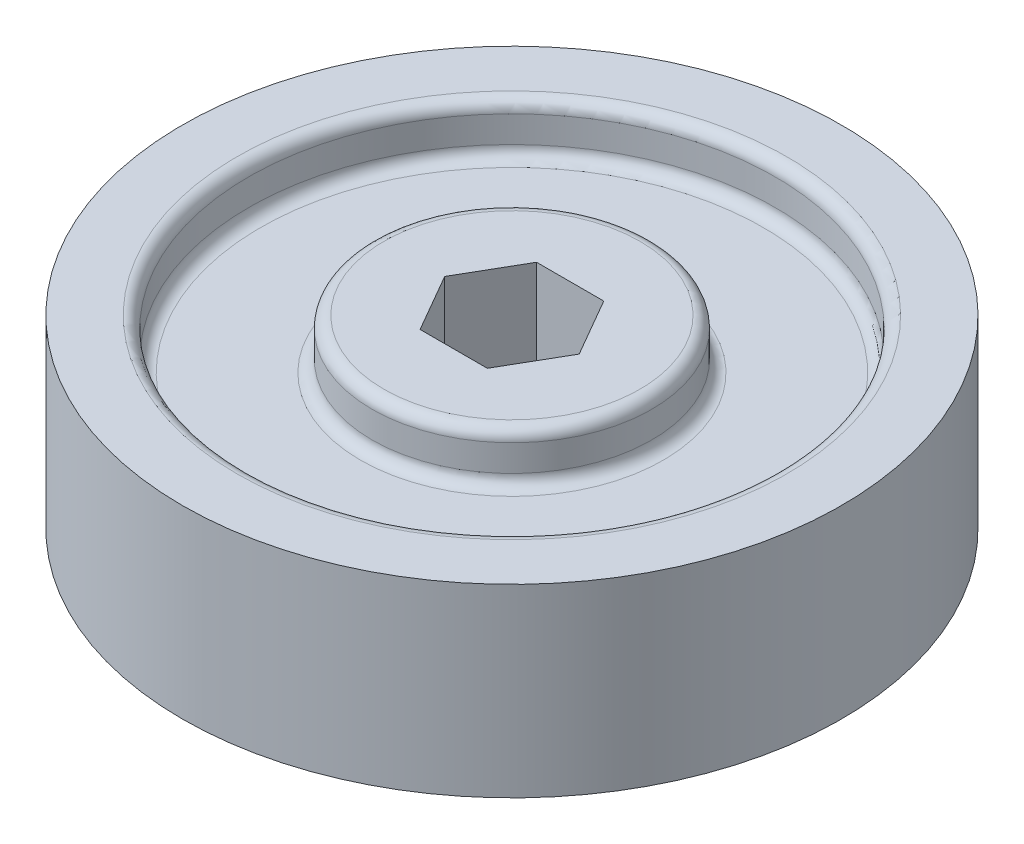
ISO-10303-21;
HEADER;
FILE_DESCRIPTION(('STEP AP214'),'2;1');
FILE_NAME('part.step','',(''),(''),'','','');
FILE_SCHEMA(('AUTOMOTIVE_DESIGN { 1 0 10303 214 1 1 1 1 }'));
ENDSEC;
DATA;
#1=APPLICATION_CONTEXT('core data for automotive mechanical design processes');
#2=APPLICATION_PROTOCOL_DEFINITION('international standard','automotive_design',2000,#1);
#3=PRODUCT_CONTEXT('',#1,'mechanical');
#4=PRODUCT('Part','Part','',(#3));
#5=PRODUCT_RELATED_PRODUCT_CATEGORY('part','',(#4));
#6=PRODUCT_DEFINITION_FORMATION('','',#4);
#7=PRODUCT_DEFINITION_CONTEXT('part definition',#1,'design');
#8=PRODUCT_DEFINITION('design','',#6,#7);
#9=PRODUCT_DEFINITION_SHAPE('','',#8);
#10=(LENGTH_UNIT() NAMED_UNIT(*) SI_UNIT(.MILLI.,.METRE.));
#11=(NAMED_UNIT(*) PLANE_ANGLE_UNIT() SI_UNIT($,.RADIAN.));
#12=(NAMED_UNIT(*) SI_UNIT($,.STERADIAN.) SOLID_ANGLE_UNIT());
#13=UNCERTAINTY_MEASURE_WITH_UNIT(LENGTH_MEASURE(1.E-05),#10,'distance_accuracy_value','');
#14=(GEOMETRIC_REPRESENTATION_CONTEXT(3) GLOBAL_UNCERTAINTY_ASSIGNED_CONTEXT((#13)) GLOBAL_UNIT_ASSIGNED_CONTEXT((#10,
#11,#12)) REPRESENTATION_CONTEXT('',''));
#15=CARTESIAN_POINT('',(0.,0.,0.));
#16=DIRECTION('',(0.,0.,1.));
#17=DIRECTION('',(1.,0.,0.));
#18=AXIS2_PLACEMENT_3D('',#15,#16,#17);
#19=CARTESIAN_POINT('',(0.,0.,0.));
#20=DIRECTION('',(0.,1.,0.));
#21=DIRECTION('',(0.,0.,1.));
#22=AXIS2_PLACEMENT_3D('',#19,#20,#21);
#23=PLANE('',#22);
#24=CARTESIAN_POINT('',(0.,0.,0.));
#25=DIRECTION('',(0.,1.,0.));
#26=DIRECTION('',(0.,0.,1.));
#27=AXIS2_PLACEMENT_3D('',#24,#25,#26);
#28=CIRCLE('',#27,13.97);
#29=CARTESIAN_POINT('',(0.,0.,13.97));
#30=VERTEX_POINT('',#29);
#31=EDGE_CURVE('E11',#30,#30,#28,.F.);
#32=ORIENTED_EDGE('',*,*,#31,.T.);
#33=EDGE_LOOP('',(#32));
#34=FACE_BOUND('',#33,.T.);
#35=DIRECTION('',(1.,0.,0.));
#36=VECTOR('',#35,1.);
#37=CARTESIAN_POINT('',(-3.66617420935413,0.,6.35));
#38=LINE('',#37,#36);
#39=CARTESIAN_POINT('',(-3.66617420935413,0.,6.35));
#40=VERTEX_POINT('',#39);
#41=CARTESIAN_POINT('',(3.66617420935412,0.,6.35));
#42=VERTEX_POINT('',#41);
#43=EDGE_CURVE('E75',#40,#42,#38,.T.);
#44=ORIENTED_EDGE('',*,*,#43,.T.);
#45=DIRECTION('',(0.5,0.,-0.866025403784439));
#46=VECTOR('',#45,1.);
#47=CARTESIAN_POINT('',(3.66617420935412,0.,6.35));
#48=LINE('',#47,#46);
#49=CARTESIAN_POINT('',(7.33234841870825,0.,0.));
#50=VERTEX_POINT('',#49);
#51=EDGE_CURVE('E127',#42,#50,#48,.T.);
#52=ORIENTED_EDGE('',*,*,#51,.T.);
#53=DIRECTION('',(-0.5,0.,-0.866025403784439));
#54=VECTOR('',#53,1.);
#55=CARTESIAN_POINT('',(7.33234841870825,0.,0.));
#56=LINE('',#55,#54);
#57=CARTESIAN_POINT('',(3.66617420935413,0.,-6.35));
#58=VERTEX_POINT('',#57);
#59=EDGE_CURVE('E156',#50,#58,#56,.T.);
#60=ORIENTED_EDGE('',*,*,#59,.T.);
#61=DIRECTION('',(-1.,0.,0.));
#62=VECTOR('',#61,1.);
#63=CARTESIAN_POINT('',(3.66617420935413,0.,-6.35));
#64=LINE('',#63,#62);
#65=CARTESIAN_POINT('',(-3.66617420935412,0.,-6.35));
#66=VERTEX_POINT('',#65);
#67=EDGE_CURVE('E160',#58,#66,#64,.T.);
#68=ORIENTED_EDGE('',*,*,#67,.T.);
#69=DIRECTION('',(-0.5,0.,0.866025403784438));
#70=VECTOR('',#69,1.);
#71=CARTESIAN_POINT('',(-3.66617420935412,0.,-6.35));
#72=LINE('',#71,#70);
#73=CARTESIAN_POINT('',(-7.33234841870824,0.,0.));
#74=VERTEX_POINT('',#73);
#75=EDGE_CURVE('E164',#66,#74,#72,.T.);
#76=ORIENTED_EDGE('',*,*,#75,.T.);
#77=DIRECTION('',(0.5,0.,0.866025403784439));
#78=VECTOR('',#77,1.);
#79=CARTESIAN_POINT('',(-7.33234841870824,0.,0.));
#80=LINE('',#79,#78);
#81=EDGE_CURVE('E121',#74,#40,#80,.T.);
#82=ORIENTED_EDGE('',*,*,#81,.T.);
#83=EDGE_LOOP('',(#44,#52,#60,#68,#76,#82));
#84=FACE_BOUND('',#83,.T.);
#85=ADVANCED_FACE('F45',(#34,#84),#23,.F.);
#86=CARTESIAN_POINT('',(0.,20.1676,0.));
#87=DIRECTION('',(0.,1.,0.));
#88=DIRECTION('',(0.,0.,1.));
#89=AXIS2_PLACEMENT_3D('',#86,#87,#88);
#90=PLANE('',#89);
#91=CARTESIAN_POINT('',(0.,20.1676,0.));
#92=DIRECTION('',(0.,1.,0.));
#93=DIRECTION('',(0.,0.,1.));
#94=AXIS2_PLACEMENT_3D('',#91,#92,#93);
#95=CIRCLE('',#94,13.97);
#96=CARTESIAN_POINT('',(0.,20.1676,13.97));
#97=VERTEX_POINT('',#96);
#98=EDGE_CURVE('E206',#97,#97,#95,.T.);
#99=ORIENTED_EDGE('',*,*,#98,.T.);
#100=EDGE_LOOP('',(#99));
#101=FACE_BOUND('',#100,.T.);
#102=DIRECTION('',(0.5,0.,-0.866025403784439));
#103=VECTOR('',#102,1.);
#104=CARTESIAN_POINT('',(3.66617420935412,20.1676,6.35));
#105=LINE('',#104,#103);
#106=CARTESIAN_POINT('',(3.66617420935412,20.1676,6.35));
#107=VERTEX_POINT('',#106);
#108=CARTESIAN_POINT('',(7.33234841870825,20.1676,0.));
#109=VERTEX_POINT('',#108);
#110=EDGE_CURVE('E120',#107,#109,#105,.T.);
#111=ORIENTED_EDGE('',*,*,#110,.F.);
#112=DIRECTION('',(1.,0.,0.));
#113=VECTOR('',#112,1.);
#114=CARTESIAN_POINT('',(-3.66617420935413,20.1676,6.35));
#115=LINE('',#114,#113);
#116=CARTESIAN_POINT('',(-3.66617420935413,20.1676,6.35));
#117=VERTEX_POINT('',#116);
#118=EDGE_CURVE('E111',#117,#107,#115,.T.);
#119=ORIENTED_EDGE('',*,*,#118,.F.);
#120=DIRECTION('',(0.5,0.,0.866025403784439));
#121=VECTOR('',#120,1.);
#122=CARTESIAN_POINT('',(-7.33234841870824,20.1676,0.));
#123=LINE('',#122,#121);
#124=CARTESIAN_POINT('',(-7.33234841870824,20.1676,0.));
#125=VERTEX_POINT('',#124);
#126=EDGE_CURVE('E149',#125,#117,#123,.T.);
#127=ORIENTED_EDGE('',*,*,#126,.F.);
#128=DIRECTION('',(-0.5,0.,0.866025403784438));
#129=VECTOR('',#128,1.);
#130=CARTESIAN_POINT('',(-3.66617420935412,20.1676,-6.35));
#131=LINE('',#130,#129);
#132=CARTESIAN_POINT('',(-3.66617420935412,20.1676,-6.35));
#133=VERTEX_POINT('',#132);
#134=EDGE_CURVE('E146',#133,#125,#131,.T.);
#135=ORIENTED_EDGE('',*,*,#134,.F.);
#136=DIRECTION('',(-1.,0.,0.));
#137=VECTOR('',#136,1.);
#138=CARTESIAN_POINT('',(3.66617420935413,20.1676,-6.35));
#139=LINE('',#138,#137);
#140=CARTESIAN_POINT('',(3.66617420935413,20.1676,-6.35));
#141=VERTEX_POINT('',#140);
#142=EDGE_CURVE('E141',#141,#133,#139,.T.);
#143=ORIENTED_EDGE('',*,*,#142,.F.);
#144=DIRECTION('',(-0.5,0.,-0.866025403784439));
#145=VECTOR('',#144,1.);
#146=CARTESIAN_POINT('',(7.33234841870825,20.1676,0.));
#147=LINE('',#146,#145);
#148=EDGE_CURVE('E135',#109,#141,#147,.T.);
#149=ORIENTED_EDGE('',*,*,#148,.F.);
#150=EDGE_LOOP('',(#111,#119,#127,#135,#143,#149));
#151=FACE_BOUND('',#150,.T.);
#152=ADVANCED_FACE('F133',(#101,#151),#90,.T.);
#153=CARTESIAN_POINT('',(0.,20.1676,0.));
#154=DIRECTION('',(0.,1.,0.));
#155=DIRECTION('',(0.,0.,1.));
#156=AXIS2_PLACEMENT_3D('',#153,#154,#155);
#157=CIRCLE('',#156,29.972);
#158=CARTESIAN_POINT('',(0.,20.1676,29.972));
#159=VERTEX_POINT('',#158);
#160=EDGE_CURVE('E216',#159,#159,#157,.F.);
#161=ORIENTED_EDGE('',*,*,#160,.T.);
#162=EDGE_LOOP('',(#161));
#163=FACE_BOUND('',#162,.T.);
#164=CARTESIAN_POINT('',(0.,20.1676,0.));
#165=DIRECTION('',(0.,1.,0.));
#166=DIRECTION('',(0.,0.,1.));
#167=AXIS2_PLACEMENT_3D('',#164,#165,#166);
#168=CIRCLE('',#167,35.941);
#169=CARTESIAN_POINT('',(0.,20.1676,35.941));
#170=VERTEX_POINT('',#169);
#171=EDGE_CURVE('E183',#170,#170,#168,.T.);
#172=ORIENTED_EDGE('',*,*,#171,.T.);
#173=EDGE_LOOP('',(#172));
#174=FACE_BOUND('',#173,.T.);
#175=ADVANCED_FACE('F270',(#163,#174),#90,.T.);
#176=CARTESIAN_POINT('',(0.,0.,0.));
#177=DIRECTION('',(0.,1.,0.));
#178=DIRECTION('',(0.,0.,1.));
#179=AXIS2_PLACEMENT_3D('',#176,#177,#178);
#180=CIRCLE('',#179,29.972);
#181=CARTESIAN_POINT('',(0.,0.,29.972));
#182=VERTEX_POINT('',#181);
#183=EDGE_CURVE('E228',#182,#182,#180,.T.);
#184=ORIENTED_EDGE('',*,*,#183,.T.);
#185=EDGE_LOOP('',(#184));
#186=FACE_BOUND('',#185,.T.);
#187=CARTESIAN_POINT('',(0.,0.,0.));
#188=DIRECTION('',(0.,1.,0.));
#189=DIRECTION('',(0.,0.,1.));
#190=AXIS2_PLACEMENT_3D('',#187,#188,#189);
#191=CIRCLE('',#190,35.941);
#192=CARTESIAN_POINT('',(0.,0.,35.941));
#193=VERTEX_POINT('',#192);
#194=EDGE_CURVE('E129',#193,#193,#191,.T.);
#195=ORIENTED_EDGE('',*,*,#194,.F.);
#196=EDGE_LOOP('',(#195));
#197=FACE_BOUND('',#196,.T.);
#198=ADVANCED_FACE('F266',(#186,#197),#23,.F.);
#199=CARTESIAN_POINT('',(0.,20.1676,0.));
#200=DIRECTION('',(0.,-1.,0.));
#201=DIRECTION('',(0.,0.,-1.));
#202=AXIS2_PLACEMENT_3D('',#199,#200,#201);
#203=CYLINDRICAL_SURFACE('',#202,35.941);
#204=ORIENTED_EDGE('',*,*,#171,.F.);
#205=EDGE_LOOP('',(#204));
#206=FACE_BOUND('',#205,.T.);
#207=ORIENTED_EDGE('',*,*,#194,.T.);
#208=EDGE_LOOP('',(#207));
#209=FACE_BOUND('',#208,.T.);
#210=ADVANCED_FACE('F276',(#206,#209),#203,.T.);
#211=CARTESIAN_POINT('',(-3.66617420935413,20.1676,6.35));
#212=DIRECTION('',(0.,0.,-1.));
#213=DIRECTION('',(-1.,0.,0.));
#214=AXIS2_PLACEMENT_3D('',#211,#212,#213);
#215=PLANE('',#214);
#216=ORIENTED_EDGE('',*,*,#43,.F.);
#217=DIRECTION('',(0.,-1.,0.));
#218=VECTOR('',#217,1.);
#219=CARTESIAN_POINT('',(-3.66617420935413,20.1676,6.35));
#220=LINE('',#219,#218);
#221=EDGE_CURVE('E115',#117,#40,#220,.T.);
#222=ORIENTED_EDGE('',*,*,#221,.F.);
#223=ORIENTED_EDGE('',*,*,#118,.T.);
#224=DIRECTION('',(0.,-1.,0.));
#225=VECTOR('',#224,1.);
#226=CARTESIAN_POINT('',(3.66617420935412,20.1676,6.35));
#227=LINE('',#226,#225);
#228=EDGE_CURVE('E114',#107,#42,#227,.T.);
#229=ORIENTED_EDGE('',*,*,#228,.T.);
#230=EDGE_LOOP('',(#216,#222,#223,#229));
#231=FACE_BOUND('',#230,.T.);
#232=ADVANCED_FACE('F113',(#231),#215,.T.);
#233=CARTESIAN_POINT('',(3.66617420935412,20.1676,6.35));
#234=DIRECTION('',(-0.866025403784438,0.,-0.5));
#235=DIRECTION('',(-0.5,0.,0.866025403784439));
#236=AXIS2_PLACEMENT_3D('',#233,#234,#235);
#237=PLANE('',#236);
#238=ORIENTED_EDGE('',*,*,#51,.F.);
#239=ORIENTED_EDGE('',*,*,#228,.F.);
#240=ORIENTED_EDGE('',*,*,#110,.T.);
#241=DIRECTION('',(0.,-1.,0.));
#242=VECTOR('',#241,1.);
#243=CARTESIAN_POINT('',(7.33234841870825,20.1676,0.));
#244=LINE('',#243,#242);
#245=EDGE_CURVE('E130',#109,#50,#244,.T.);
#246=ORIENTED_EDGE('',*,*,#245,.T.);
#247=EDGE_LOOP('',(#238,#239,#240,#246));
#248=FACE_BOUND('',#247,.T.);
#249=ADVANCED_FACE('F124',(#248),#237,.T.);
#250=CARTESIAN_POINT('',(7.33234841870825,20.1676,0.));
#251=DIRECTION('',(-0.866025403784439,0.,0.5));
#252=DIRECTION('',(0.5,0.,0.866025403784439));
#253=AXIS2_PLACEMENT_3D('',#250,#251,#252);
#254=PLANE('',#253);
#255=ORIENTED_EDGE('',*,*,#59,.F.);
#256=ORIENTED_EDGE('',*,*,#245,.F.);
#257=ORIENTED_EDGE('',*,*,#148,.T.);
#258=DIRECTION('',(0.,-1.,0.));
#259=VECTOR('',#258,1.);
#260=CARTESIAN_POINT('',(3.66617420935413,20.1676,-6.35));
#261=LINE('',#260,#259);
#262=EDGE_CURVE('E178',#141,#58,#261,.T.);
#263=ORIENTED_EDGE('',*,*,#262,.T.);
#264=EDGE_LOOP('',(#255,#256,#257,#263));
#265=FACE_BOUND('',#264,.T.);
#266=ADVANCED_FACE('F335',(#265),#254,.T.);
#267=CARTESIAN_POINT('',(3.66617420935413,20.1676,-6.35));
#268=DIRECTION('',(0.,0.,1.));
#269=DIRECTION('',(1.,0.,0.));
#270=AXIS2_PLACEMENT_3D('',#267,#268,#269);
#271=PLANE('',#270);
#272=ORIENTED_EDGE('',*,*,#67,.F.);
#273=ORIENTED_EDGE('',*,*,#262,.F.);
#274=ORIENTED_EDGE('',*,*,#142,.T.);
#275=DIRECTION('',(0.,-1.,0.));
#276=VECTOR('',#275,1.);
#277=CARTESIAN_POINT('',(-3.66617420935412,20.1676,-6.35));
#278=LINE('',#277,#276);
#279=EDGE_CURVE('E175',#133,#66,#278,.T.);
#280=ORIENTED_EDGE('',*,*,#279,.T.);
#281=EDGE_LOOP('',(#272,#273,#274,#280));
#282=FACE_BOUND('',#281,.T.);
#283=ADVANCED_FACE('F331',(#282),#271,.T.);
#284=CARTESIAN_POINT('',(-3.66617420935412,20.1676,-6.35));
#285=DIRECTION('',(0.866025403784438,0.,0.5));
#286=DIRECTION('',(0.5,0.,-0.866025403784438));
#287=AXIS2_PLACEMENT_3D('',#284,#285,#286);
#288=PLANE('',#287);
#289=ORIENTED_EDGE('',*,*,#75,.F.);
#290=ORIENTED_EDGE('',*,*,#279,.F.);
#291=ORIENTED_EDGE('',*,*,#134,.T.);
#292=DIRECTION('',(0.,-1.,0.));
#293=VECTOR('',#292,1.);
#294=CARTESIAN_POINT('',(-7.33234841870824,20.1676,0.));
#295=LINE('',#294,#293);
#296=EDGE_CURVE('E64',#125,#74,#295,.T.);
#297=ORIENTED_EDGE('',*,*,#296,.T.);
#298=EDGE_LOOP('',(#289,#290,#291,#297));
#299=FACE_BOUND('',#298,.T.);
#300=ADVANCED_FACE('F328',(#299),#288,.T.);
#301=CARTESIAN_POINT('',(-7.33234841870824,20.1676,0.));
#302=DIRECTION('',(0.866025403784439,0.,-0.5));
#303=DIRECTION('',(-0.5,0.,-0.866025403784439));
#304=AXIS2_PLACEMENT_3D('',#301,#302,#303);
#305=PLANE('',#304);
#306=ORIENTED_EDGE('',*,*,#81,.F.);
#307=ORIENTED_EDGE('',*,*,#296,.F.);
#308=ORIENTED_EDGE('',*,*,#126,.T.);
#309=ORIENTED_EDGE('',*,*,#221,.T.);
#310=EDGE_LOOP('',(#306,#307,#308,#309));
#311=FACE_BOUND('',#310,.T.);
#312=ADVANCED_FACE('F324',(#311),#305,.T.);
#313=CARTESIAN_POINT('',(0.,14.732,0.));
#314=DIRECTION('',(0.,1.,0.));
#315=DIRECTION('',(0.,0.,1.));
#316=AXIS2_PLACEMENT_3D('',#313,#314,#315);
#317=CYLINDRICAL_SURFACE('',#316,28.702);
#318=CARTESIAN_POINT('',(0.,16.002,0.));
#319=DIRECTION('',(0.,1.,0.));
#320=DIRECTION('',(0.,0.,1.));
#321=AXIS2_PLACEMENT_3D('',#318,#319,#320);
#322=CIRCLE('',#321,28.702);
#323=CARTESIAN_POINT('',(0.,16.002,28.702));
#324=VERTEX_POINT('',#323);
#325=EDGE_CURVE('E202',#324,#324,#322,.F.);
#326=ORIENTED_EDGE('',*,*,#325,.T.);
#327=EDGE_LOOP('',(#326));
#328=FACE_BOUND('',#327,.T.);
#329=CARTESIAN_POINT('',(0.,18.8976,0.));
#330=DIRECTION('',(0.,1.,0.));
#331=DIRECTION('',(0.,0.,1.));
#332=AXIS2_PLACEMENT_3D('',#329,#330,#331);
#333=CIRCLE('',#332,28.702);
#334=CARTESIAN_POINT('',(0.,18.8976,28.702));
#335=VERTEX_POINT('',#334);
#336=EDGE_CURVE('E198',#335,#335,#333,.T.);
#337=ORIENTED_EDGE('',*,*,#336,.T.);
#338=EDGE_LOOP('',(#337));
#339=FACE_BOUND('',#338,.T.);
#340=ADVANCED_FACE('F320',(#328,#339),#317,.F.);
#341=CARTESIAN_POINT('',(0.,14.732,0.));
#342=DIRECTION('',(0.,1.,0.));
#343=DIRECTION('',(0.,0.,1.));
#344=AXIS2_PLACEMENT_3D('',#341,#342,#343);
#345=PLANE('',#344);
#346=CARTESIAN_POINT('',(0.,14.732,0.));
#347=DIRECTION('',(0.,1.,0.));
#348=DIRECTION('',(0.,0.,1.));
#349=AXIS2_PLACEMENT_3D('',#346,#347,#348);
#350=CIRCLE('',#349,27.432);
#351=CARTESIAN_POINT('',(0.,14.732,27.432));
#352=VERTEX_POINT('',#351);
#353=EDGE_CURVE('E194',#352,#352,#350,.T.);
#354=ORIENTED_EDGE('',*,*,#353,.T.);
#355=EDGE_LOOP('',(#354));
#356=FACE_BOUND('',#355,.T.);
#357=CARTESIAN_POINT('',(0.,14.732,0.));
#358=DIRECTION('',(0.,1.,0.));
#359=DIRECTION('',(0.,0.,1.));
#360=AXIS2_PLACEMENT_3D('',#357,#358,#359);
#361=CIRCLE('',#360,16.51);
#362=CARTESIAN_POINT('',(0.,14.732,16.51));
#363=VERTEX_POINT('',#362);
#364=EDGE_CURVE('E187',#363,#363,#361,.F.);
#365=ORIENTED_EDGE('',*,*,#364,.T.);
#366=EDGE_LOOP('',(#365));
#367=FACE_BOUND('',#366,.T.);
#368=ADVANCED_FACE('F316',(#356,#367),#345,.T.);
#369=CARTESIAN_POINT('',(0.,14.732,0.));
#370=DIRECTION('',(0.,1.,0.));
#371=DIRECTION('',(0.,0.,1.));
#372=AXIS2_PLACEMENT_3D('',#369,#370,#371);
#373=CYLINDRICAL_SURFACE('',#372,15.24);
#374=CARTESIAN_POINT('',(0.,18.8976,0.));
#375=DIRECTION('',(0.,1.,0.));
#376=DIRECTION('',(0.,0.,1.));
#377=AXIS2_PLACEMENT_3D('',#374,#375,#376);
#378=CIRCLE('',#377,15.24);
#379=CARTESIAN_POINT('',(0.,18.8976,15.24));
#380=VERTEX_POINT('',#379);
#381=EDGE_CURVE('E213',#380,#380,#378,.F.);
#382=ORIENTED_EDGE('',*,*,#381,.T.);
#383=EDGE_LOOP('',(#382));
#384=FACE_BOUND('',#383,.T.);
#385=CARTESIAN_POINT('',(0.,16.002,0.));
#386=DIRECTION('',(0.,1.,0.));
#387=DIRECTION('',(0.,0.,1.));
#388=AXIS2_PLACEMENT_3D('',#385,#386,#387);
#389=CIRCLE('',#388,15.24);
#390=CARTESIAN_POINT('',(0.,16.002,15.24));
#391=VERTEX_POINT('',#390);
#392=EDGE_CURVE('E209',#391,#391,#389,.T.);
#393=ORIENTED_EDGE('',*,*,#392,.T.);
#394=EDGE_LOOP('',(#393));
#395=FACE_BOUND('',#394,.T.);
#396=ADVANCED_FACE('F299',(#384,#395),#373,.T.);
#397=CARTESIAN_POINT('',(0.,5.4356,0.));
#398=DIRECTION('',(0.,-1.,0.));
#399=DIRECTION('',(0.,0.,-1.));
#400=AXIS2_PLACEMENT_3D('',#397,#398,#399);
#401=CYLINDRICAL_SURFACE('',#400,28.702);
#402=CARTESIAN_POINT('',(0.,1.27,0.));
#403=DIRECTION('',(0.,1.,0.));
#404=DIRECTION('',(0.,0.,1.));
#405=AXIS2_PLACEMENT_3D('',#402,#403,#404);
#406=CIRCLE('',#405,28.702);
#407=CARTESIAN_POINT('',(0.,1.27,28.702));
#408=VERTEX_POINT('',#407);
#409=EDGE_CURVE('E224',#408,#408,#406,.F.);
#410=ORIENTED_EDGE('',*,*,#409,.T.);
#411=EDGE_LOOP('',(#410));
#412=FACE_BOUND('',#411,.T.);
#413=CARTESIAN_POINT('',(0.,4.1656,0.));
#414=DIRECTION('',(0.,-1.,0.));
#415=DIRECTION('',(0.,0.,-1.));
#416=AXIS2_PLACEMENT_3D('',#413,#414,#415);
#417=CIRCLE('',#416,28.702);
#418=CARTESIAN_POINT('',(0.,4.1656,-28.702));
#419=VERTEX_POINT('',#418);
#420=EDGE_CURVE('E220',#419,#419,#417,.F.);
#421=ORIENTED_EDGE('',*,*,#420,.T.);
#422=EDGE_LOOP('',(#421));
#423=FACE_BOUND('',#422,.T.);
#424=ADVANCED_FACE('F295',(#412,#423),#401,.F.);
#425=CARTESIAN_POINT('',(0.,5.4356,0.));
#426=DIRECTION('',(0.,-1.,0.));
#427=DIRECTION('',(0.,0.,-1.));
#428=AXIS2_PLACEMENT_3D('',#425,#426,#427);
#429=PLANE('',#428);
#430=CARTESIAN_POINT('',(0.,5.4356,0.));
#431=DIRECTION('',(0.,-1.,0.));
#432=DIRECTION('',(0.,0.,-1.));
#433=AXIS2_PLACEMENT_3D('',#430,#431,#432);
#434=CIRCLE('',#433,27.432);
#435=CARTESIAN_POINT('',(0.,5.4356,-27.432));
#436=VERTEX_POINT('',#435);
#437=EDGE_CURVE('E236',#436,#436,#434,.T.);
#438=ORIENTED_EDGE('',*,*,#437,.T.);
#439=EDGE_LOOP('',(#438));
#440=FACE_BOUND('',#439,.T.);
#441=CARTESIAN_POINT('',(0.,5.4356,0.));
#442=DIRECTION('',(0.,-1.,0.));
#443=DIRECTION('',(0.,0.,-1.));
#444=AXIS2_PLACEMENT_3D('',#441,#442,#443);
#445=CIRCLE('',#444,16.51);
#446=CARTESIAN_POINT('',(0.,5.4356,-16.51));
#447=VERTEX_POINT('',#446);
#448=EDGE_CURVE('E232',#447,#447,#445,.F.);
#449=ORIENTED_EDGE('',*,*,#448,.T.);
#450=EDGE_LOOP('',(#449));
#451=FACE_BOUND('',#450,.T.);
#452=ADVANCED_FACE('F298',(#440,#451),#429,.T.);
#453=CARTESIAN_POINT('',(0.,5.4356,0.));
#454=DIRECTION('',(0.,-1.,0.));
#455=DIRECTION('',(0.,0.,-1.));
#456=AXIS2_PLACEMENT_3D('',#453,#454,#455);
#457=CYLINDRICAL_SURFACE('',#456,15.24);
#458=CARTESIAN_POINT('',(0.,4.1656,0.));
#459=DIRECTION('',(0.,-1.,0.));
#460=DIRECTION('',(0.,0.,-1.));
#461=AXIS2_PLACEMENT_3D('',#458,#459,#460);
#462=CIRCLE('',#461,15.24);
#463=CARTESIAN_POINT('',(0.,4.1656,-15.24));
#464=VERTEX_POINT('',#463);
#465=EDGE_CURVE('E54',#464,#464,#462,.T.);
#466=ORIENTED_EDGE('',*,*,#465,.T.);
#467=EDGE_LOOP('',(#466));
#468=FACE_BOUND('',#467,.T.);
#469=CARTESIAN_POINT('',(0.,1.27,0.));
#470=DIRECTION('',(0.,1.,0.));
#471=DIRECTION('',(0.,0.,1.));
#472=AXIS2_PLACEMENT_3D('',#469,#470,#471);
#473=CIRCLE('',#472,15.24);
#474=CARTESIAN_POINT('',(0.,1.27,15.24));
#475=VERTEX_POINT('',#474);
#476=EDGE_CURVE('E240',#475,#475,#473,.T.);
#477=ORIENTED_EDGE('',*,*,#476,.T.);
#478=EDGE_LOOP('',(#477));
#479=FACE_BOUND('',#478,.T.);
#480=ADVANCED_FACE('F247',(#468,#479),#457,.T.);
#481=CARTESIAN_POINT('',(0.,16.002,0.));
#482=DIRECTION('',(0.,1.,0.));
#483=DIRECTION('',(0.,0.,1.));
#484=AXIS2_PLACEMENT_3D('',#481,#482,#483);
#485=TOROIDAL_SURFACE('',#484,27.432,1.27);
#486=ORIENTED_EDGE('',*,*,#325,.F.);
#487=EDGE_LOOP('',(#486));
#488=FACE_BOUND('',#487,.T.);
#489=ORIENTED_EDGE('',*,*,#353,.F.);
#490=EDGE_LOOP('',(#489));
#491=FACE_BOUND('',#490,.T.);
#492=ADVANCED_FACE('F311',(#488,#491),#485,.F.);
#493=CARTESIAN_POINT('',(0.,18.8976,0.));
#494=DIRECTION('',(0.,1.,0.));
#495=DIRECTION('',(0.,0.,1.));
#496=AXIS2_PLACEMENT_3D('',#493,#494,#495);
#497=TOROIDAL_SURFACE('',#496,13.97,1.27);
#498=ORIENTED_EDGE('',*,*,#381,.F.);
#499=EDGE_LOOP('',(#498));
#500=FACE_BOUND('',#499,.T.);
#501=ORIENTED_EDGE('',*,*,#98,.F.);
#502=EDGE_LOOP('',(#501));
#503=FACE_BOUND('',#502,.T.);
#504=ADVANCED_FACE('F415',(#500,#503),#497,.T.);
#505=CARTESIAN_POINT('',(0.,16.002,0.));
#506=DIRECTION('',(0.,1.,0.));
#507=DIRECTION('',(0.,0.,1.));
#508=AXIS2_PLACEMENT_3D('',#505,#506,#507);
#509=TOROIDAL_SURFACE('',#508,16.51,1.27);
#510=ORIENTED_EDGE('',*,*,#364,.F.);
#511=EDGE_LOOP('',(#510));
#512=FACE_BOUND('',#511,.T.);
#513=ORIENTED_EDGE('',*,*,#392,.F.);
#514=EDGE_LOOP('',(#513));
#515=FACE_BOUND('',#514,.T.);
#516=ADVANCED_FACE('F421',(#512,#515),#509,.F.);
#517=CARTESIAN_POINT('',(0.,18.8976,0.));
#518=DIRECTION('',(0.,1.,0.));
#519=DIRECTION('',(0.,0.,1.));
#520=AXIS2_PLACEMENT_3D('',#517,#518,#519);
#521=TOROIDAL_SURFACE('',#520,29.972,1.27);
#522=ORIENTED_EDGE('',*,*,#160,.F.);
#523=EDGE_LOOP('',(#522));
#524=FACE_BOUND('',#523,.T.);
#525=ORIENTED_EDGE('',*,*,#336,.F.);
#526=EDGE_LOOP('',(#525));
#527=FACE_BOUND('',#526,.T.);
#528=ADVANCED_FACE('F291',(#524,#527),#521,.T.);
#529=CARTESIAN_POINT('',(0.,1.27,0.));
#530=DIRECTION('',(0.,1.,0.));
#531=DIRECTION('',(0.,0.,1.));
#532=AXIS2_PLACEMENT_3D('',#529,#530,#531);
#533=TOROIDAL_SURFACE('',#532,29.972,1.27);
#534=ORIENTED_EDGE('',*,*,#183,.F.);
#535=EDGE_LOOP('',(#534));
#536=FACE_BOUND('',#535,.T.);
#537=ORIENTED_EDGE('',*,*,#409,.F.);
#538=EDGE_LOOP('',(#537));
#539=FACE_BOUND('',#538,.T.);
#540=ADVANCED_FACE('F259',(#536,#539),#533,.T.);
#541=CARTESIAN_POINT('',(0.,4.1656,0.));
#542=DIRECTION('',(0.,-1.,0.));
#543=DIRECTION('',(0.,0.,-1.));
#544=AXIS2_PLACEMENT_3D('',#541,#542,#543);
#545=TOROIDAL_SURFACE('',#544,27.432,1.27);
#546=ORIENTED_EDGE('',*,*,#420,.F.);
#547=EDGE_LOOP('',(#546));
#548=FACE_BOUND('',#547,.T.);
#549=ORIENTED_EDGE('',*,*,#437,.F.);
#550=EDGE_LOOP('',(#549));
#551=FACE_BOUND('',#550,.T.);
#552=ADVANCED_FACE('F252',(#548,#551),#545,.F.);
#553=CARTESIAN_POINT('',(0.,4.1656,0.));
#554=DIRECTION('',(0.,-1.,0.));
#555=DIRECTION('',(0.,0.,-1.));
#556=AXIS2_PLACEMENT_3D('',#553,#554,#555);
#557=TOROIDAL_SURFACE('',#556,16.51,1.27);
#558=ORIENTED_EDGE('',*,*,#448,.F.);
#559=EDGE_LOOP('',(#558));
#560=FACE_BOUND('',#559,.T.);
#561=ORIENTED_EDGE('',*,*,#465,.F.);
#562=EDGE_LOOP('',(#561));
#563=FACE_BOUND('',#562,.T.);
#564=ADVANCED_FACE('F250',(#560,#563),#557,.F.);
#565=CARTESIAN_POINT('',(0.,1.27,0.));
#566=DIRECTION('',(0.,1.,0.));
#567=DIRECTION('',(0.,0.,1.));
#568=AXIS2_PLACEMENT_3D('',#565,#566,#567);
#569=TOROIDAL_SURFACE('',#568,13.97,1.27);
#570=ORIENTED_EDGE('',*,*,#476,.F.);
#571=EDGE_LOOP('',(#570));
#572=FACE_BOUND('',#571,.T.);
#573=ORIENTED_EDGE('',*,*,#31,.F.);
#574=EDGE_LOOP('',(#573));
#575=FACE_BOUND('',#574,.T.);
#576=ADVANCED_FACE('F47',(#572,#575),#569,.T.);
#577=CLOSED_SHELL('',(#85,#152,#175,#198,#210,#232,#249,#266,#283,#300,#312,#340,#368,#396,#424,
#452,#480,#492,#504,#516,#528,#540,#552,#564,#576));
#578=MANIFOLD_SOLID_BREP('B2',#577);
#579=ADVANCED_BREP_SHAPE_REPRESENTATION('',(#18,#578),#14);
#580=SHAPE_DEFINITION_REPRESENTATION(#9,#579);
ENDSEC;
END-ISO-10303-21;
